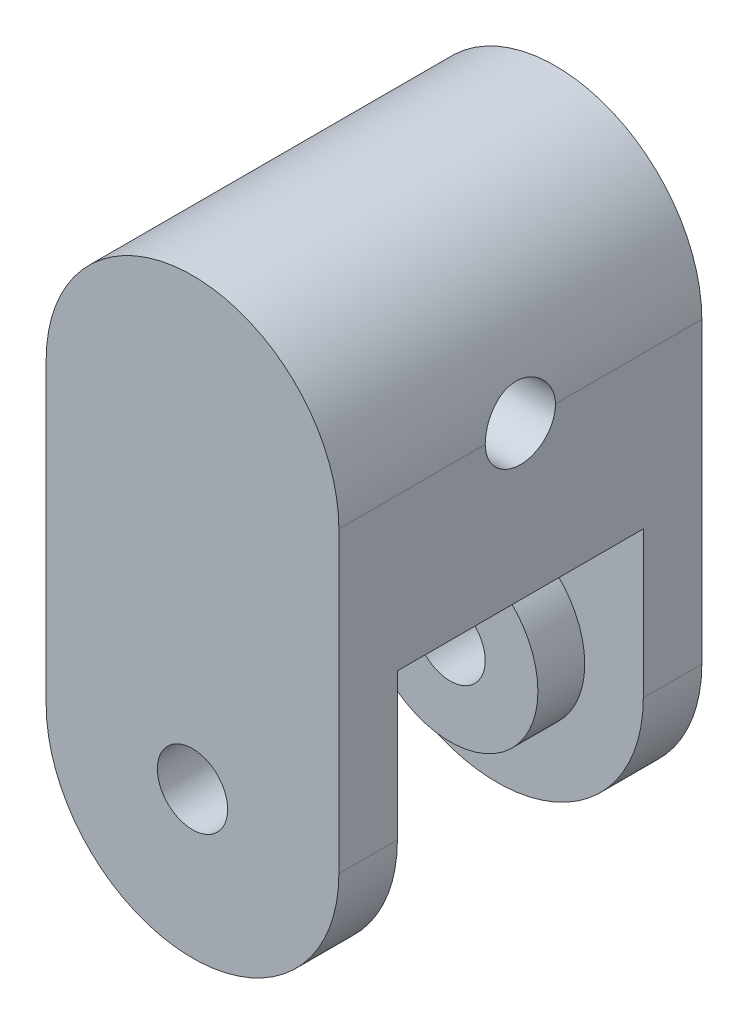
ISO-10303-21;
HEADER;
FILE_DESCRIPTION(('STEP AP214'),'2;1');
FILE_NAME('part.step','',(''),(''),'','','');
FILE_SCHEMA(('AUTOMOTIVE_DESIGN { 1 0 10303 214 1 1 1 1 }'));
ENDSEC;
DATA;
#1=APPLICATION_CONTEXT('core data for automotive mechanical design processes');
#2=APPLICATION_PROTOCOL_DEFINITION('international standard','automotive_design',2000,#1);
#3=PRODUCT_CONTEXT('',#1,'mechanical');
#4=PRODUCT('Part','Part','',(#3));
#5=PRODUCT_RELATED_PRODUCT_CATEGORY('part','',(#4));
#6=PRODUCT_DEFINITION_FORMATION('','',#4);
#7=PRODUCT_DEFINITION_CONTEXT('part definition',#1,'design');
#8=PRODUCT_DEFINITION('design','',#6,#7);
#9=PRODUCT_DEFINITION_SHAPE('','',#8);
#10=(LENGTH_UNIT() NAMED_UNIT(*) SI_UNIT(.MILLI.,.METRE.));
#11=(NAMED_UNIT(*) PLANE_ANGLE_UNIT() SI_UNIT($,.RADIAN.));
#12=(NAMED_UNIT(*) SI_UNIT($,.STERADIAN.) SOLID_ANGLE_UNIT());
#13=UNCERTAINTY_MEASURE_WITH_UNIT(LENGTH_MEASURE(1.E-05),#10,'distance_accuracy_value','');
#14=(GEOMETRIC_REPRESENTATION_CONTEXT(3) GLOBAL_UNCERTAINTY_ASSIGNED_CONTEXT((#13)) GLOBAL_UNIT_ASSIGNED_CONTEXT((#10,
#11,#12)) REPRESENTATION_CONTEXT('',''));
#15=CARTESIAN_POINT('',(0.,0.,0.));
#16=DIRECTION('',(0.,0.,1.));
#17=DIRECTION('',(1.,0.,0.));
#18=AXIS2_PLACEMENT_3D('',#15,#16,#17);
#19=CARTESIAN_POINT('',(0.,0.,15.5));
#20=DIRECTION('',(0.,0.,-1.));
#21=DIRECTION('',(-1.,0.,0.));
#22=AXIS2_PLACEMENT_3D('',#19,#20,#21);
#23=CYLINDRICAL_SURFACE('',#22,12.5);
#24=DIRECTION('',(0.,0.,-1.));
#25=VECTOR('',#24,1.);
#26=CARTESIAN_POINT('',(12.5,0.,15.5));
#27=LINE('',#26,#25);
#28=CARTESIAN_POINT('',(12.5,0.,-10.5));
#29=VERTEX_POINT('',#28);
#30=CARTESIAN_POINT('',(12.5,0.,-15.5));
#31=VERTEX_POINT('',#30);
#32=EDGE_CURVE('E247',#29,#31,#27,.T.);
#33=ORIENTED_EDGE('',*,*,#32,.F.);
#34=CARTESIAN_POINT('',(0.,0.,-10.5));
#35=DIRECTION('',(0.,0.,-1.));
#36=DIRECTION('',(-1.,0.,0.));
#37=AXIS2_PLACEMENT_3D('',#34,#35,#36);
#38=CIRCLE('',#37,12.5);
#39=CARTESIAN_POINT('',(-12.5,0.,-10.5));
#40=VERTEX_POINT('',#39);
#41=EDGE_CURVE('E57',#29,#40,#38,.T.);
#42=ORIENTED_EDGE('',*,*,#41,.T.);
#43=DIRECTION('',(0.,0.,-1.));
#44=VECTOR('',#43,1.);
#45=CARTESIAN_POINT('',(-12.5,0.,15.5));
#46=LINE('',#45,#44);
#47=CARTESIAN_POINT('',(-12.5,0.,-15.5));
#48=VERTEX_POINT('',#47);
#49=EDGE_CURVE('E258',#40,#48,#46,.T.);
#50=ORIENTED_EDGE('',*,*,#49,.T.);
#51=CARTESIAN_POINT('',(0.,0.,-15.5));
#52=DIRECTION('',(0.,0.,1.));
#53=DIRECTION('',(1.,0.,0.));
#54=AXIS2_PLACEMENT_3D('',#51,#52,#53);
#55=CIRCLE('',#54,12.5);
#56=EDGE_CURVE('E249',#48,#31,#55,.T.);
#57=ORIENTED_EDGE('',*,*,#56,.T.);
#58=EDGE_LOOP('',(#33,#42,#50,#57));
#59=FACE_BOUND('',#58,.T.);
#60=ADVANCED_FACE('F40',(#59),#23,.T.);
#61=CARTESIAN_POINT('',(12.5,12.5,15.5));
#62=DIRECTION('',(-1.,0.,0.));
#63=DIRECTION('',(0.,0.,1.));
#64=AXIS2_PLACEMENT_3D('',#61,#62,#63);
#65=PLANE('',#64);
#66=DIRECTION('',(0.,1.,0.));
#67=VECTOR('',#66,1.);
#68=CARTESIAN_POINT('',(12.5,12.5,-15.5));
#69=LINE('',#68,#67);
#70=CARTESIAN_POINT('',(12.5,25.5,-15.5));
#71=VERTEX_POINT('',#70);
#72=EDGE_CURVE('E252',#31,#71,#69,.T.);
#73=ORIENTED_EDGE('',*,*,#72,.T.);
#74=DIRECTION('',(0.,0.,1.));
#75=VECTOR('',#74,1.);
#76=CARTESIAN_POINT('',(12.5,25.5,-51.2106426713382));
#77=LINE('',#76,#75);
#78=CARTESIAN_POINT('',(12.5,25.5,-3.));
#79=VERTEX_POINT('',#78);
#80=EDGE_CURVE('E422',#71,#79,#77,.T.);
#81=ORIENTED_EDGE('',*,*,#80,.T.);
#82=CARTESIAN_POINT('',(12.5,25.5,0.));
#83=DIRECTION('',(-1.,0.,0.));
#84=DIRECTION('',(0.,0.,1.));
#85=AXIS2_PLACEMENT_3D('',#82,#83,#84);
#86=CIRCLE('',#85,3.);
#87=CARTESIAN_POINT('',(12.5,25.5,3.));
#88=VERTEX_POINT('',#87);
#89=EDGE_CURVE('E135',#79,#88,#86,.T.);
#90=ORIENTED_EDGE('',*,*,#89,.T.);
#91=CARTESIAN_POINT('',(12.5,25.5,15.5));
#92=VERTEX_POINT('',#91);
#93=EDGE_CURVE('E418',#88,#92,#77,.T.);
#94=ORIENTED_EDGE('',*,*,#93,.T.);
#95=DIRECTION('',(0.,1.,0.));
#96=VECTOR('',#95,1.);
#97=CARTESIAN_POINT('',(12.5,12.5,15.5));
#98=LINE('',#97,#96);
#99=CARTESIAN_POINT('',(12.5,0.,15.5));
#100=VERTEX_POINT('',#99);
#101=EDGE_CURVE('E181',#100,#92,#98,.T.);
#102=ORIENTED_EDGE('',*,*,#101,.F.);
#103=DIRECTION('',(0.,0.,-1.));
#104=VECTOR('',#103,1.);
#105=CARTESIAN_POINT('',(12.5,0.,15.5));
#106=LINE('',#105,#104);
#107=CARTESIAN_POINT('',(12.5,0.,10.5));
#108=VERTEX_POINT('',#107);
#109=EDGE_CURVE('E192',#100,#108,#106,.T.);
#110=ORIENTED_EDGE('',*,*,#109,.T.);
#111=DIRECTION('',(0.,1.,0.));
#112=VECTOR('',#111,1.);
#113=CARTESIAN_POINT('',(12.5,-12.5,10.5));
#114=LINE('',#113,#112);
#115=CARTESIAN_POINT('',(12.5,12.5,10.5));
#116=VERTEX_POINT('',#115);
#117=EDGE_CURVE('E170',#108,#116,#114,.T.);
#118=ORIENTED_EDGE('',*,*,#117,.T.);
#119=DIRECTION('',(0.,0.,1.));
#120=VECTOR('',#119,1.);
#121=CARTESIAN_POINT('',(12.5,12.5,-51.2106426713382));
#122=LINE('',#121,#120);
#123=CARTESIAN_POINT('',(12.5,12.5,-10.5));
#124=VERTEX_POINT('',#123);
#125=EDGE_CURVE('E147',#124,#116,#122,.T.);
#126=ORIENTED_EDGE('',*,*,#125,.F.);
#127=DIRECTION('',(0.,1.,0.));
#128=VECTOR('',#127,1.);
#129=CARTESIAN_POINT('',(12.5,-12.5,-10.5));
#130=LINE('',#129,#128);
#131=EDGE_CURVE('E270',#29,#124,#130,.T.);
#132=ORIENTED_EDGE('',*,*,#131,.F.);
#133=ORIENTED_EDGE('',*,*,#32,.T.);
#134=EDGE_LOOP('',(#73,#81,#90,#94,#102,#110,#118,#126,#132,#133));
#135=FACE_BOUND('',#134,.T.);
#136=ADVANCED_FACE('F236',(#135),#65,.F.);
#137=CARTESIAN_POINT('',(-12.5,0.,15.5));
#138=DIRECTION('',(1.,0.,0.));
#139=DIRECTION('',(0.,0.,-1.));
#140=AXIS2_PLACEMENT_3D('',#137,#138,#139);
#141=PLANE('',#140);
#142=ORIENTED_EDGE('',*,*,#49,.F.);
#143=DIRECTION('',(0.,1.,0.));
#144=VECTOR('',#143,1.);
#145=CARTESIAN_POINT('',(-12.5,0.,-10.5));
#146=LINE('',#145,#144);
#147=CARTESIAN_POINT('',(-12.5,12.5,-10.5));
#148=VERTEX_POINT('',#147);
#149=EDGE_CURVE('E256',#40,#148,#146,.T.);
#150=ORIENTED_EDGE('',*,*,#149,.T.);
#151=DIRECTION('',(0.,0.,1.));
#152=VECTOR('',#151,1.);
#153=CARTESIAN_POINT('',(-12.5,12.5,-51.2106426713382));
#154=LINE('',#153,#152);
#155=CARTESIAN_POINT('',(-12.5,12.5,10.5));
#156=VERTEX_POINT('',#155);
#157=EDGE_CURVE('E143',#148,#156,#154,.T.);
#158=ORIENTED_EDGE('',*,*,#157,.T.);
#159=DIRECTION('',(0.,1.,0.));
#160=VECTOR('',#159,1.);
#161=CARTESIAN_POINT('',(-12.5,0.,10.5));
#162=LINE('',#161,#160);
#163=CARTESIAN_POINT('',(-12.5,0.,10.5));
#164=VERTEX_POINT('',#163);
#165=EDGE_CURVE('E166',#164,#156,#162,.T.);
#166=ORIENTED_EDGE('',*,*,#165,.F.);
#167=DIRECTION('',(0.,0.,-1.));
#168=VECTOR('',#167,1.);
#169=CARTESIAN_POINT('',(-12.5,0.,15.5));
#170=LINE('',#169,#168);
#171=CARTESIAN_POINT('',(-12.5,0.,15.5));
#172=VERTEX_POINT('',#171);
#173=EDGE_CURVE('E188',#172,#164,#170,.T.);
#174=ORIENTED_EDGE('',*,*,#173,.F.);
#175=DIRECTION('',(0.,-1.,0.));
#176=VECTOR('',#175,1.);
#177=CARTESIAN_POINT('',(-12.5,0.,15.5));
#178=LINE('',#177,#176);
#179=CARTESIAN_POINT('',(-12.5,25.5,15.5));
#180=VERTEX_POINT('',#179);
#181=EDGE_CURVE('E185',#180,#172,#178,.T.);
#182=ORIENTED_EDGE('',*,*,#181,.F.);
#183=DIRECTION('',(0.,0.,1.));
#184=VECTOR('',#183,1.);
#185=CARTESIAN_POINT('',(-12.5,25.5,-51.2106426713382));
#186=LINE('',#185,#184);
#187=CARTESIAN_POINT('',(-12.5,25.5,3.));
#188=VERTEX_POINT('',#187);
#189=EDGE_CURVE('E133',#188,#180,#186,.T.);
#190=ORIENTED_EDGE('',*,*,#189,.F.);
#191=CARTESIAN_POINT('',(-12.5,25.5,0.));
#192=DIRECTION('',(1.,0.,0.));
#193=DIRECTION('',(0.,0.,-1.));
#194=AXIS2_PLACEMENT_3D('',#191,#192,#193);
#195=CIRCLE('',#194,3.);
#196=CARTESIAN_POINT('',(-12.5,25.5,-3.));
#197=VERTEX_POINT('',#196);
#198=EDGE_CURVE('E119',#188,#197,#195,.T.);
#199=ORIENTED_EDGE('',*,*,#198,.T.);
#200=CARTESIAN_POINT('',(-12.5,25.5,-15.5));
#201=VERTEX_POINT('',#200);
#202=EDGE_CURVE('E131',#201,#197,#186,.T.);
#203=ORIENTED_EDGE('',*,*,#202,.F.);
#204=DIRECTION('',(0.,-1.,0.));
#205=VECTOR('',#204,1.);
#206=CARTESIAN_POINT('',(-12.5,0.,-15.5));
#207=LINE('',#206,#205);
#208=EDGE_CURVE('E272',#201,#48,#207,.T.);
#209=ORIENTED_EDGE('',*,*,#208,.T.);
#210=EDGE_LOOP('',(#142,#150,#158,#166,#174,#182,#190,#199,#203,#209));
#211=FACE_BOUND('',#210,.T.);
#212=ADVANCED_FACE('F129',(#211),#141,.F.);
#213=CARTESIAN_POINT('',(0.,0.,-15.5));
#214=DIRECTION('',(0.,0.,1.));
#215=DIRECTION('',(1.,0.,0.));
#216=AXIS2_PLACEMENT_3D('',#213,#214,#215);
#217=PLANE('',#216);
#218=CARTESIAN_POINT('',(0.,0.,-15.5));
#219=DIRECTION('',(0.,0.,1.));
#220=DIRECTION('',(1.,0.,0.));
#221=AXIS2_PLACEMENT_3D('',#218,#219,#220);
#222=CIRCLE('',#221,3.);
#223=CARTESIAN_POINT('',(3.,0.,-15.5));
#224=VERTEX_POINT('',#223);
#225=EDGE_CURVE('E268',#224,#224,#222,.T.);
#226=ORIENTED_EDGE('',*,*,#225,.T.);
#227=EDGE_LOOP('',(#226));
#228=FACE_BOUND('',#227,.T.);
#229=ORIENTED_EDGE('',*,*,#56,.F.);
#230=ORIENTED_EDGE('',*,*,#208,.F.);
#231=CARTESIAN_POINT('',(0.,25.5,-15.5));
#232=DIRECTION('',(0.,0.,1.));
#233=DIRECTION('',(1.,0.,0.));
#234=AXIS2_PLACEMENT_3D('',#231,#232,#233);
#235=CIRCLE('',#234,12.5);
#236=EDGE_CURVE('E141',#201,#71,#235,.F.);
#237=ORIENTED_EDGE('',*,*,#236,.T.);
#238=ORIENTED_EDGE('',*,*,#72,.F.);
#239=EDGE_LOOP('',(#229,#230,#237,#238));
#240=FACE_BOUND('',#239,.T.);
#241=ADVANCED_FACE('F301',(#228,#240),#217,.F.);
#242=CARTESIAN_POINT('',(12.5,-12.5,-10.5));
#243=DIRECTION('',(0.,0.,-1.));
#244=DIRECTION('',(-1.,0.,0.));
#245=AXIS2_PLACEMENT_3D('',#242,#243,#244);
#246=PLANE('',#245);
#247=CARTESIAN_POINT('',(0.,0.,-10.5));
#248=DIRECTION('',(0.,0.,1.));
#249=DIRECTION('',(1.,0.,0.));
#250=AXIS2_PLACEMENT_3D('',#247,#248,#249);
#251=CIRCLE('',#250,7.5);
#252=CARTESIAN_POINT('',(7.5,0.,-10.5));
#253=VERTEX_POINT('',#252);
#254=EDGE_CURVE('E11',#253,#253,#251,.T.);
#255=ORIENTED_EDGE('',*,*,#254,.F.);
#256=EDGE_LOOP('',(#255));
#257=FACE_BOUND('',#256,.T.);
#258=ORIENTED_EDGE('',*,*,#131,.T.);
#259=DIRECTION('',(-1.,0.,0.));
#260=VECTOR('',#259,1.);
#261=CARTESIAN_POINT('',(12.5,12.5,-10.5));
#262=LINE('',#261,#260);
#263=EDGE_CURVE('E50',#124,#148,#262,.T.);
#264=ORIENTED_EDGE('',*,*,#263,.T.);
#265=ORIENTED_EDGE('',*,*,#149,.F.);
#266=ORIENTED_EDGE('',*,*,#41,.F.);
#267=EDGE_LOOP('',(#258,#264,#265,#266));
#268=FACE_BOUND('',#267,.T.);
#269=ADVANCED_FACE('F297',(#257,#268),#246,.F.);
#270=CARTESIAN_POINT('',(0.,0.,-6.5));
#271=DIRECTION('',(0.,0.,-1.));
#272=DIRECTION('',(-1.,0.,0.));
#273=AXIS2_PLACEMENT_3D('',#270,#271,#272);
#274=CYLINDRICAL_SURFACE('',#273,7.5);
#275=CARTESIAN_POINT('',(0.,0.,-6.5));
#276=DIRECTION('',(0.,0.,1.));
#277=DIRECTION('',(1.,0.,0.));
#278=AXIS2_PLACEMENT_3D('',#275,#276,#277);
#279=CIRCLE('',#278,7.5);
#280=CARTESIAN_POINT('',(7.5,0.,-6.5));
#281=VERTEX_POINT('',#280);
#282=EDGE_CURVE('E264',#281,#281,#279,.T.);
#283=ORIENTED_EDGE('',*,*,#282,.F.);
#284=EDGE_LOOP('',(#283));
#285=FACE_BOUND('',#284,.T.);
#286=ORIENTED_EDGE('',*,*,#254,.T.);
#287=EDGE_LOOP('',(#286));
#288=FACE_BOUND('',#287,.T.);
#289=ADVANCED_FACE('F291',(#285,#288),#274,.T.);
#290=CARTESIAN_POINT('',(0.,0.,-6.5));
#291=DIRECTION('',(0.,0.,1.));
#292=DIRECTION('',(1.,0.,0.));
#293=AXIS2_PLACEMENT_3D('',#290,#291,#292);
#294=PLANE('',#293);
#295=CARTESIAN_POINT('',(0.,0.,-6.5));
#296=DIRECTION('',(0.,0.,1.));
#297=DIRECTION('',(1.,0.,0.));
#298=AXIS2_PLACEMENT_3D('',#295,#296,#297);
#299=CIRCLE('',#298,3.);
#300=CARTESIAN_POINT('',(3.,0.,-6.5));
#301=VERTEX_POINT('',#300);
#302=EDGE_CURVE('E43',#301,#301,#299,.T.);
#303=ORIENTED_EDGE('',*,*,#302,.F.);
#304=EDGE_LOOP('',(#303));
#305=FACE_BOUND('',#304,.T.);
#306=ORIENTED_EDGE('',*,*,#282,.T.);
#307=EDGE_LOOP('',(#306));
#308=FACE_BOUND('',#307,.T.);
#309=ADVANCED_FACE('F232',(#305,#308),#294,.T.);
#310=CARTESIAN_POINT('',(0.,0.,15.5));
#311=DIRECTION('',(0.,0.,-1.));
#312=DIRECTION('',(-1.,0.,0.));
#313=AXIS2_PLACEMENT_3D('',#310,#311,#312);
#314=CYLINDRICAL_SURFACE('',#313,3.);
#315=ORIENTED_EDGE('',*,*,#302,.T.);
#316=EDGE_LOOP('',(#315));
#317=FACE_BOUND('',#316,.T.);
#318=ORIENTED_EDGE('',*,*,#225,.F.);
#319=EDGE_LOOP('',(#318));
#320=FACE_BOUND('',#319,.T.);
#321=ADVANCED_FACE('F223',(#317,#320),#314,.F.);
#322=CARTESIAN_POINT('',(-12.5,12.5,-51.2106426713382));
#323=DIRECTION('',(0.,-1.,0.));
#324=DIRECTION('',(0.,0.,-1.));
#325=AXIS2_PLACEMENT_3D('',#322,#323,#324);
#326=PLANE('',#325);
#327=ORIENTED_EDGE('',*,*,#263,.F.);
#328=ORIENTED_EDGE('',*,*,#125,.T.);
#329=DIRECTION('',(-1.,0.,0.));
#330=VECTOR('',#329,1.);
#331=CARTESIAN_POINT('',(12.5,12.5,10.5));
#332=LINE('',#331,#330);
#333=EDGE_CURVE('E161',#116,#156,#332,.T.);
#334=ORIENTED_EDGE('',*,*,#333,.T.);
#335=ORIENTED_EDGE('',*,*,#157,.F.);
#336=EDGE_LOOP('',(#327,#328,#334,#335));
#337=FACE_BOUND('',#336,.T.);
#338=ADVANCED_FACE('F219',(#337),#326,.T.);
#339=CARTESIAN_POINT('',(0.,0.,15.5));
#340=DIRECTION('',(0.,0.,1.));
#341=DIRECTION('',(1.,0.,0.));
#342=AXIS2_PLACEMENT_3D('',#339,#340,#341);
#343=PLANE('',#342);
#344=CARTESIAN_POINT('',(0.,0.,15.5));
#345=DIRECTION('',(0.,0.,-1.));
#346=DIRECTION('',(-1.,0.,0.));
#347=AXIS2_PLACEMENT_3D('',#344,#345,#346);
#348=CIRCLE('',#347,3.);
#349=CARTESIAN_POINT('',(-3.,0.,15.5));
#350=VERTEX_POINT('',#349);
#351=EDGE_CURVE('E152',#350,#350,#348,.T.);
#352=ORIENTED_EDGE('',*,*,#351,.T.);
#353=EDGE_LOOP('',(#352));
#354=FACE_BOUND('',#353,.T.);
#355=CARTESIAN_POINT('',(0.,0.,15.5));
#356=DIRECTION('',(0.,0.,1.));
#357=DIRECTION('',(1.,0.,0.));
#358=AXIS2_PLACEMENT_3D('',#355,#356,#357);
#359=CIRCLE('',#358,12.5);
#360=EDGE_CURVE('E177',#172,#100,#359,.T.);
#361=ORIENTED_EDGE('',*,*,#360,.T.);
#362=ORIENTED_EDGE('',*,*,#101,.T.);
#363=CARTESIAN_POINT('',(0.,25.5,15.5));
#364=DIRECTION('',(0.,0.,1.));
#365=DIRECTION('',(1.,0.,0.));
#366=AXIS2_PLACEMENT_3D('',#363,#364,#365);
#367=CIRCLE('',#366,12.5);
#368=EDGE_CURVE('E149',#92,#180,#367,.T.);
#369=ORIENTED_EDGE('',*,*,#368,.T.);
#370=ORIENTED_EDGE('',*,*,#181,.T.);
#371=EDGE_LOOP('',(#361,#362,#369,#370));
#372=FACE_BOUND('',#371,.T.);
#373=ADVANCED_FACE('F222',(#354,#372),#343,.T.);
#374=CARTESIAN_POINT('',(0.,0.,15.5));
#375=DIRECTION('',(0.,0.,-1.));
#376=DIRECTION('',(-1.,0.,0.));
#377=AXIS2_PLACEMENT_3D('',#374,#375,#376);
#378=CYLINDRICAL_SURFACE('',#377,12.5);
#379=CARTESIAN_POINT('',(0.,0.,10.5));
#380=DIRECTION('',(0.,0.,-1.));
#381=DIRECTION('',(-1.,0.,0.));
#382=AXIS2_PLACEMENT_3D('',#379,#380,#381);
#383=CIRCLE('',#382,12.5);
#384=EDGE_CURVE('E174',#108,#164,#383,.T.);
#385=ORIENTED_EDGE('',*,*,#384,.F.);
#386=ORIENTED_EDGE('',*,*,#109,.F.);
#387=ORIENTED_EDGE('',*,*,#360,.F.);
#388=ORIENTED_EDGE('',*,*,#173,.T.);
#389=EDGE_LOOP('',(#385,#386,#387,#388));
#390=FACE_BOUND('',#389,.T.);
#391=ADVANCED_FACE('F228',(#390),#378,.T.);
#392=CARTESIAN_POINT('',(12.5,-12.5,10.5));
#393=DIRECTION('',(0.,0.,-1.));
#394=DIRECTION('',(-1.,0.,0.));
#395=AXIS2_PLACEMENT_3D('',#392,#393,#394);
#396=PLANE('',#395);
#397=CARTESIAN_POINT('',(0.,0.,10.5));
#398=DIRECTION('',(0.,0.,-1.));
#399=DIRECTION('',(-1.,0.,0.));
#400=AXIS2_PLACEMENT_3D('',#397,#398,#399);
#401=CIRCLE('',#400,7.5);
#402=CARTESIAN_POINT('',(-7.5,0.,10.5));
#403=VERTEX_POINT('',#402);
#404=EDGE_CURVE('E162',#403,#403,#401,.T.);
#405=ORIENTED_EDGE('',*,*,#404,.F.);
#406=EDGE_LOOP('',(#405));
#407=FACE_BOUND('',#406,.T.);
#408=ORIENTED_EDGE('',*,*,#384,.T.);
#409=ORIENTED_EDGE('',*,*,#165,.T.);
#410=ORIENTED_EDGE('',*,*,#333,.F.);
#411=ORIENTED_EDGE('',*,*,#117,.F.);
#412=EDGE_LOOP('',(#408,#409,#410,#411));
#413=FACE_BOUND('',#412,.T.);
#414=ADVANCED_FACE('F340',(#407,#413),#396,.T.);
#415=CARTESIAN_POINT('',(0.,0.,6.5));
#416=DIRECTION('',(0.,0.,1.));
#417=DIRECTION('',(1.,0.,0.));
#418=AXIS2_PLACEMENT_3D('',#415,#416,#417);
#419=CYLINDRICAL_SURFACE('',#418,7.5);
#420=CARTESIAN_POINT('',(0.,0.,6.5));
#421=DIRECTION('',(0.,0.,-1.));
#422=DIRECTION('',(-1.,0.,0.));
#423=AXIS2_PLACEMENT_3D('',#420,#421,#422);
#424=CIRCLE('',#423,7.5);
#425=CARTESIAN_POINT('',(-7.5,0.,6.5));
#426=VERTEX_POINT('',#425);
#427=EDGE_CURVE('E157',#426,#426,#424,.T.);
#428=ORIENTED_EDGE('',*,*,#427,.F.);
#429=EDGE_LOOP('',(#428));
#430=FACE_BOUND('',#429,.T.);
#431=ORIENTED_EDGE('',*,*,#404,.T.);
#432=EDGE_LOOP('',(#431));
#433=FACE_BOUND('',#432,.T.);
#434=ADVANCED_FACE('F350',(#430,#433),#419,.T.);
#435=CARTESIAN_POINT('',(0.,0.,6.5));
#436=DIRECTION('',(0.,0.,-1.));
#437=DIRECTION('',(-1.,0.,0.));
#438=AXIS2_PLACEMENT_3D('',#435,#436,#437);
#439=PLANE('',#438);
#440=CARTESIAN_POINT('',(0.,0.,6.5));
#441=DIRECTION('',(0.,0.,-1.));
#442=DIRECTION('',(-1.,0.,0.));
#443=AXIS2_PLACEMENT_3D('',#440,#441,#442);
#444=CIRCLE('',#443,3.);
#445=CARTESIAN_POINT('',(-3.,0.,6.5));
#446=VERTEX_POINT('',#445);
#447=EDGE_CURVE('E156',#446,#446,#444,.T.);
#448=ORIENTED_EDGE('',*,*,#447,.F.);
#449=EDGE_LOOP('',(#448));
#450=FACE_BOUND('',#449,.T.);
#451=ORIENTED_EDGE('',*,*,#427,.T.);
#452=EDGE_LOOP('',(#451));
#453=FACE_BOUND('',#452,.T.);
#454=ADVANCED_FACE('F360',(#450,#453),#439,.T.);
#455=CARTESIAN_POINT('',(0.,0.,15.5));
#456=DIRECTION('',(0.,0.,-1.));
#457=DIRECTION('',(-1.,0.,0.));
#458=AXIS2_PLACEMENT_3D('',#455,#456,#457);
#459=CYLINDRICAL_SURFACE('',#458,3.);
#460=ORIENTED_EDGE('',*,*,#447,.T.);
#461=EDGE_LOOP('',(#460));
#462=FACE_BOUND('',#461,.T.);
#463=ORIENTED_EDGE('',*,*,#351,.F.);
#464=EDGE_LOOP('',(#463));
#465=FACE_BOUND('',#464,.T.);
#466=ADVANCED_FACE('F370',(#462,#465),#459,.F.);
#467=CARTESIAN_POINT('',(0.,25.5,-51.2106426713382));
#468=DIRECTION('',(0.,0.,1.));
#469=DIRECTION('',(1.,0.,0.));
#470=AXIS2_PLACEMENT_3D('',#467,#468,#469);
#471=CYLINDRICAL_SURFACE('',#470,12.5);
#472=CARTESIAN_POINT('',(-12.5,25.5,3.));
#473=CARTESIAN_POINT('',(-12.5000078993874,25.583111924504,3.00000940938072));
#474=CARTESIAN_POINT('',(-12.4991712654708,25.6662184971239,2.99654633211362));
#475=CARTESIAN_POINT('',(-12.4958675021397,25.831814655557,2.98274819008782));
#476=CARTESIAN_POINT('',(-12.4934006134145,25.9143043306307,2.97241413975203));
#477=CARTESIAN_POINT('',(-12.4869007733476,26.0779369189244,2.94497188155897));
#478=CARTESIAN_POINT('',(-12.4828706676726,26.1590820015428,2.92787598180709));
#479=CARTESIAN_POINT('',(-12.4733621291565,26.3195811077843,2.88706644347023));
#480=CARTESIAN_POINT('',(-12.4678836833599,26.3989351153793,2.86335274568893));
#481=CARTESIAN_POINT('',(-12.4494862706739,26.6334794174475,2.78253592062694));
#482=CARTESIAN_POINT('',(-12.4345989312924,26.7853005602447,2.71573192806409));
#483=CARTESIAN_POINT('',(-12.4011752816159,27.0755243698052,2.55832540385913));
#484=CARTESIAN_POINT('',(-12.3826382344655,27.2139243184694,2.4677180652183));
#485=CARTESIAN_POINT('',(-12.3435395673682,27.4760806126918,2.26344149820574));
#486=CARTESIAN_POINT('',(-12.3229488938613,27.5995481161379,2.1494065031206));
#487=CARTESIAN_POINT('',(-12.282258938128,27.8258047014315,1.90229097377602));
#488=CARTESIAN_POINT('',(-12.2621597458213,27.9285900238364,1.76920698445196));
#489=CARTESIAN_POINT('',(-12.2244374864836,28.1119018496555,1.48555054666463));
#490=CARTESIAN_POINT('',(-12.206851665881,28.1921078357221,1.334765542678));
#491=CARTESIAN_POINT('',(-12.1765726699495,28.3259187778877,1.02137161287239));
#492=CARTESIAN_POINT('',(-12.1638785242716,28.3795290103253,0.858765039682879));
#493=CARTESIAN_POINT('',(-12.145118575097,28.4576501025368,0.529525300843741));
#494=CARTESIAN_POINT('',(-12.1389342436108,28.4826820455336,0.363022684345926));
#495=CARTESIAN_POINT('',(-12.1335389436693,28.5045581676357,0.0280714627212313));
#496=CARTESIAN_POINT('',(-12.1343270932564,28.5014059117942,-0.140376893594725));
#497=CARTESIAN_POINT('',(-12.1426811564144,28.4674190490582,-0.470476671505818));
#498=CARTESIAN_POINT('',(-12.1500961566781,28.4372007828826,-0.63219596109219));
#499=CARTESIAN_POINT('',(-12.1706284864312,28.3509209228706,-0.948198647866044));
#500=CARTESIAN_POINT('',(-12.1837461445975,28.2948578394373,-1.10248161588605));
#501=CARTESIAN_POINT('',(-12.2143478692687,28.1579403814622,-1.40091487836786));
#502=CARTESIAN_POINT('',(-12.2318718801792,28.0768575811663,-1.54495610579452));
#503=CARTESIAN_POINT('',(-12.2692880098294,27.8923640941181,-1.81760778862916));
#504=CARTESIAN_POINT('',(-12.2891804526212,27.7889503504367,-1.94621612764347));
#505=CARTESIAN_POINT('',(-12.3297296358954,27.5595291098732,-2.1878792592846));
#506=CARTESIAN_POINT('',(-12.3503927760083,27.4330025126706,-2.30044068949152));
#507=CARTESIAN_POINT('',(-12.3896907725392,27.1625872850367,-2.50286379847203));
#508=CARTESIAN_POINT('',(-12.4083251021429,27.0186941654564,-2.59271958931456));
#509=CARTESIAN_POINT('',(-12.4415503789285,26.7169390020248,-2.74734704171181));
#510=CARTESIAN_POINT('',(-12.456126952911,26.5590298510872,-2.81202985064766));
#511=CARTESIAN_POINT('',(-12.4794732032695,26.2342479422082,-2.91371507813762));
#512=CARTESIAN_POINT('',(-12.4882513938625,26.0673887176583,-2.95075809276312));
#513=CARTESIAN_POINT('',(-12.4957516358677,25.8325921373546,-2.98225698793418));
#514=CARTESIAN_POINT('',(-12.4973427844774,25.7662012705403,-2.98891216087102));
#515=CARTESIAN_POINT('',(-12.4994663086257,25.6332173184524,-2.99777848078731));
#516=CARTESIAN_POINT('',(-12.5000004379339,25.5666247520452,-2.99999698899108));
#517=CARTESIAN_POINT('',(-12.5,25.5,-3.00000000000002));
#518=B_SPLINE_CURVE_WITH_KNOTS('',3,(#472,#473,#474,#475,#476,#477,#478,#479,#480,#481,#482,
#483,#484,#485,#486,#487,#488,#489,#490,#491,#492,#493,#494,#495,#496,#497,#498,#499,#500,#501,
#502,#503,#504,#505,#506,#507,#508,#509,#510,#511,#512,#513,#514,#515,#516,#517),.UNSPECIFIED.,
.F.,.F.,(4,2,2,2,2,2,2,2,2,2,2,2,2,2,2,2,2,2,2,2,2,2,4),(0.,0.249250160921383,0.498463530992009,
0.747225348324613,0.995989390907049,1.4930707338578,1.99025253783735,2.49588394700645,
3.00160718297455,3.51418375042298,4.02665858696259,4.52963198154097,5.03254175531181,
5.52428261258591,6.01605181547531,6.51245072094385,7.00891762261441,7.51833797521031,
8.02789029330086,8.53922520095585,9.04980759679208,9.24991103665644,9.4496821925746),.UNSPECIFIED.);
#519=EDGE_CURVE('E115',#188,#197,#518,.T.);
#520=ORIENTED_EDGE('',*,*,#519,.F.);
#521=ORIENTED_EDGE('',*,*,#189,.T.);
#522=ORIENTED_EDGE('',*,*,#368,.F.);
#523=ORIENTED_EDGE('',*,*,#93,.F.);
#524=CARTESIAN_POINT('',(12.5,25.5,-3.));
#525=CARTESIAN_POINT('',(12.5000078993874,25.583111924504,-3.00000940938072));
#526=CARTESIAN_POINT('',(12.4991712654708,25.6662184971239,-2.99654633211362));
#527=CARTESIAN_POINT('',(12.4958675021397,25.831814655557,-2.98274819008782));
#528=CARTESIAN_POINT('',(12.4934006134145,25.9143043306307,-2.97241413975203));
#529=CARTESIAN_POINT('',(12.4869007733476,26.0779369189244,-2.94497188155897));
#530=CARTESIAN_POINT('',(12.4828706676726,26.1590820015428,-2.92787598180709));
#531=CARTESIAN_POINT('',(12.4733621291565,26.3195811077843,-2.88706644347023));
#532=CARTESIAN_POINT('',(12.4678836833599,26.3989351153793,-2.86335274568893));
#533=CARTESIAN_POINT('',(12.4494862706739,26.6334794174475,-2.78253592062693));
#534=CARTESIAN_POINT('',(12.4345989312924,26.7853005602447,-2.71573192806409));
#535=CARTESIAN_POINT('',(12.4011752816159,27.0755243698052,-2.55832540385913));
#536=CARTESIAN_POINT('',(12.3826382344655,27.2139243184694,-2.4677180652183));
#537=CARTESIAN_POINT('',(12.3435395673682,27.4760806126918,-2.26344149820574));
#538=CARTESIAN_POINT('',(12.3229488938613,27.5995481161379,-2.1494065031206));
#539=CARTESIAN_POINT('',(12.282258938128,27.8258047014315,-1.90229097377602));
#540=CARTESIAN_POINT('',(12.2621597458213,27.9285900238364,-1.76920698445196));
#541=CARTESIAN_POINT('',(12.2244374864836,28.1119018496555,-1.48555054666463));
#542=CARTESIAN_POINT('',(12.206851665881,28.1921078357221,-1.334765542678));
#543=CARTESIAN_POINT('',(12.1765726699495,28.3259187778877,-1.02137161287239));
#544=CARTESIAN_POINT('',(12.1638785242716,28.3795290103253,-0.858765039682878));
#545=CARTESIAN_POINT('',(12.145118575097,28.4576501025368,-0.52952530084374));
#546=CARTESIAN_POINT('',(12.1389342436108,28.4826820455336,-0.363022684345924));
#547=CARTESIAN_POINT('',(12.1335389436693,28.5045581676357,-0.0280714627212292));
#548=CARTESIAN_POINT('',(12.1343270932564,28.5014059117942,0.140376893594727));
#549=CARTESIAN_POINT('',(12.1426811564144,28.4674190490582,0.470476671505821));
#550=CARTESIAN_POINT('',(12.1500961566781,28.4372007828826,0.632195961092193));
#551=CARTESIAN_POINT('',(12.1706284864312,28.3509209228706,0.948198647866047));
#552=CARTESIAN_POINT('',(12.1837461445975,28.2948578394373,1.10248161588605));
#553=CARTESIAN_POINT('',(12.2143478692687,28.1579403814622,1.40091487836786));
#554=CARTESIAN_POINT('',(12.2318718801792,28.0768575811663,1.54495610579452));
#555=CARTESIAN_POINT('',(12.2692880098294,27.8923640941181,1.81760778862916));
#556=CARTESIAN_POINT('',(12.2891804526212,27.7889503504367,1.94621612764347));
#557=CARTESIAN_POINT('',(12.3297296358954,27.5595291098732,2.1878792592846));
#558=CARTESIAN_POINT('',(12.3503927760083,27.4330025126706,2.30044068949152));
#559=CARTESIAN_POINT('',(12.3896907725392,27.1625872850367,2.50286379847203));
#560=CARTESIAN_POINT('',(12.4083251021429,27.0186941654564,2.59271958931456));
#561=CARTESIAN_POINT('',(12.4415503789285,26.7169390020248,2.74734704171182));
#562=CARTESIAN_POINT('',(12.456126952911,26.5590298510872,2.81202985064766));
#563=CARTESIAN_POINT('',(12.4794732032695,26.2342479422082,2.91371507813762));
#564=CARTESIAN_POINT('',(12.4882513938625,26.0673887176583,2.95075809276313));
#565=CARTESIAN_POINT('',(12.4957516358677,25.8325921373546,2.98225698793418));
#566=CARTESIAN_POINT('',(12.4973427844774,25.7662012705403,2.98891216087102));
#567=CARTESIAN_POINT('',(12.4994663086257,25.6332173184524,2.99777848078731));
#568=CARTESIAN_POINT('',(12.5000004379339,25.5666247520451,2.99999698899108));
#569=CARTESIAN_POINT('',(12.5,25.5,3.00000000000002));
#570=B_SPLINE_CURVE_WITH_KNOTS('',3,(#524,#525,#526,#527,#528,#529,#530,#531,#532,#533,#534,
#535,#536,#537,#538,#539,#540,#541,#542,#543,#544,#545,#546,#547,#548,#549,#550,#551,#552,#553,
#554,#555,#556,#557,#558,#559,#560,#561,#562,#563,#564,#565,#566,#567,#568,#569),.UNSPECIFIED.,
.F.,.F.,(4,2,2,2,2,2,2,2,2,2,2,2,2,2,2,2,2,2,2,2,2,2,4),(0.,0.249250160921383,0.498463530992009,
0.747225348324613,0.995989390907049,1.4930707338578,1.99025253783735,2.49588394700645,
3.00160718297455,3.51418375042297,4.02665858696259,4.52963198154097,5.03254175531181,
5.52428261258591,6.01605181547531,6.51245072094385,7.0089176226144,7.51833797521031,
8.02789029330087,8.53922520095586,9.04980759679208,9.24991103665644,9.4496821925746),.UNSPECIFIED.);
#571=EDGE_CURVE('E124',#79,#88,#570,.T.);
#572=ORIENTED_EDGE('',*,*,#571,.F.);
#573=ORIENTED_EDGE('',*,*,#80,.F.);
#574=ORIENTED_EDGE('',*,*,#236,.F.);
#575=ORIENTED_EDGE('',*,*,#202,.T.);
#576=EDGE_LOOP('',(#520,#521,#522,#523,#572,#573,#574,#575));
#577=FACE_BOUND('',#576,.T.);
#578=ADVANCED_FACE('F138',(#577),#471,.T.);
#579=CARTESIAN_POINT('',(-12.5,25.5,0.));
#580=DIRECTION('',(1.,0.,0.));
#581=DIRECTION('',(0.,0.,-1.));
#582=AXIS2_PLACEMENT_3D('',#579,#580,#581);
#583=CYLINDRICAL_SURFACE('',#582,3.);
#584=ORIENTED_EDGE('',*,*,#519,.T.);
#585=ORIENTED_EDGE('',*,*,#198,.F.);
#586=EDGE_LOOP('',(#584,#585));
#587=FACE_BOUND('',#586,.T.);
#588=ORIENTED_EDGE('',*,*,#571,.T.);
#589=ORIENTED_EDGE('',*,*,#89,.F.);
#590=EDGE_LOOP('',(#588,#589));
#591=FACE_BOUND('',#590,.T.);
#592=ADVANCED_FACE('F117',(#587,#591),#583,.F.);
#593=CLOSED_SHELL('',(#60,#136,#212,#241,#269,#289,#309,#321,#338,#373,#391,#414,#434,#454,#466,
#578,#592));
#594=MANIFOLD_SOLID_BREP('B2',#593);
#595=ADVANCED_BREP_SHAPE_REPRESENTATION('',(#18,#594),#14);
#596=SHAPE_DEFINITION_REPRESENTATION(#9,#595);
ENDSEC;
END-ISO-10303-21;
